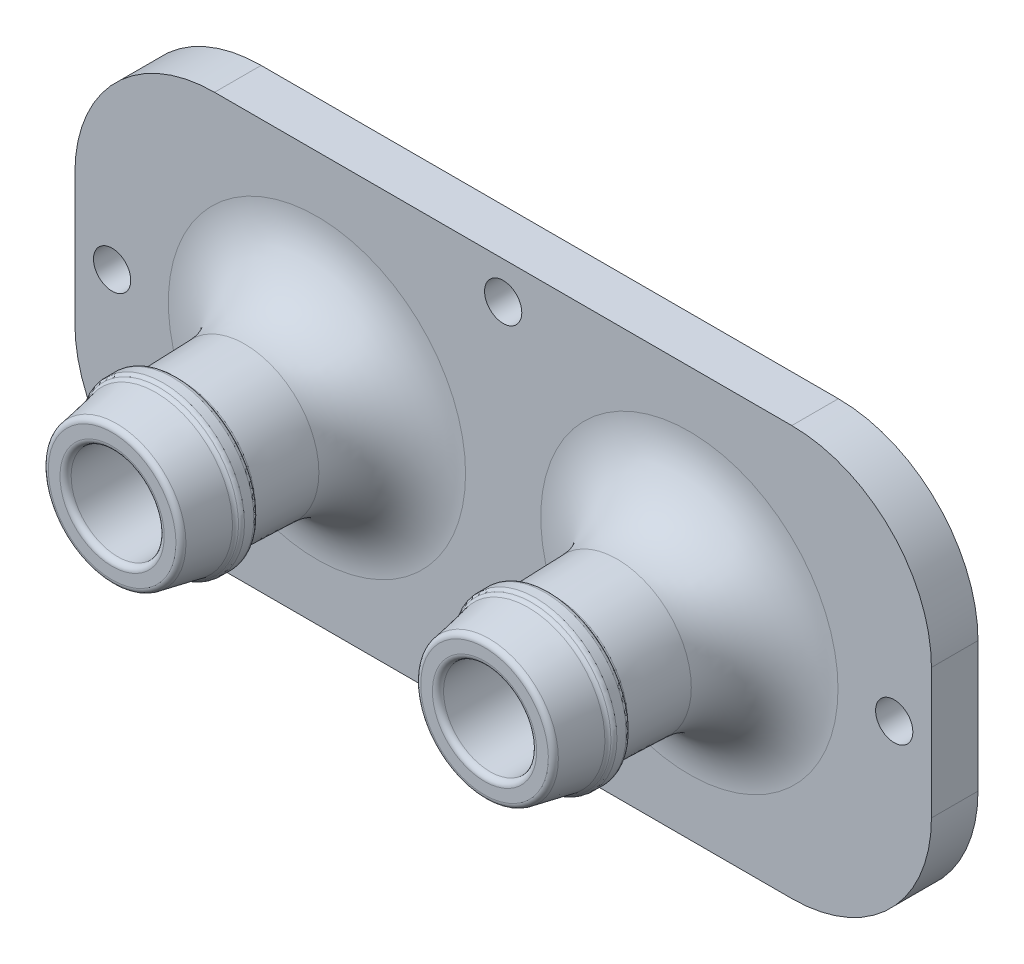
ISO-10303-21;
HEADER;
FILE_DESCRIPTION(('STEP AP214'),'2;1');
FILE_NAME('part.step','',(''),(''),'','','');
FILE_SCHEMA(('AUTOMOTIVE_DESIGN { 1 0 10303 214 1 1 1 1 }'));
ENDSEC;
DATA;
#1=APPLICATION_CONTEXT('core data for automotive mechanical design processes');
#2=APPLICATION_PROTOCOL_DEFINITION('international standard','automotive_design',2000,#1);
#3=PRODUCT_CONTEXT('',#1,'mechanical');
#4=PRODUCT('Part','Part','',(#3));
#5=PRODUCT_RELATED_PRODUCT_CATEGORY('part','',(#4));
#6=PRODUCT_DEFINITION_FORMATION('','',#4);
#7=PRODUCT_DEFINITION_CONTEXT('part definition',#1,'design');
#8=PRODUCT_DEFINITION('design','',#6,#7);
#9=PRODUCT_DEFINITION_SHAPE('','',#8);
#10=(LENGTH_UNIT() NAMED_UNIT(*) SI_UNIT(.MILLI.,.METRE.));
#11=(NAMED_UNIT(*) PLANE_ANGLE_UNIT() SI_UNIT($,.RADIAN.));
#12=(NAMED_UNIT(*) SI_UNIT($,.STERADIAN.) SOLID_ANGLE_UNIT());
#13=UNCERTAINTY_MEASURE_WITH_UNIT(LENGTH_MEASURE(1.E-05),#10,'distance_accuracy_value','');
#14=(GEOMETRIC_REPRESENTATION_CONTEXT(3) GLOBAL_UNCERTAINTY_ASSIGNED_CONTEXT((#13)) GLOBAL_UNIT_ASSIGNED_CONTEXT((#10,
#11,#12)) REPRESENTATION_CONTEXT('',''));
#15=CARTESIAN_POINT('',(0.,0.,0.));
#16=DIRECTION('',(0.,0.,1.));
#17=DIRECTION('',(1.,0.,0.));
#18=AXIS2_PLACEMENT_3D('',#15,#16,#17);
#19=CARTESIAN_POINT('',(0.,0.,0.));
#20=DIRECTION('',(0.,0.,1.));
#21=DIRECTION('',(1.,0.,0.));
#22=AXIS2_PLACEMENT_3D('',#19,#20,#21);
#23=PLANE('',#22);
#24=CARTESIAN_POINT('',(0.,18.,0.));
#25=DIRECTION('',(0.,0.,1.));
#26=DIRECTION('',(1.,0.,0.));
#27=AXIS2_PLACEMENT_3D('',#24,#25,#26);
#28=CIRCLE('',#27,2.);
#29=CARTESIAN_POINT('',(2.,18.,0.));
#30=VERTEX_POINT('',#29);
#31=EDGE_CURVE('E408',#30,#30,#28,.T.);
#32=ORIENTED_EDGE('',*,*,#31,.T.);
#33=EDGE_LOOP('',(#32));
#34=FACE_BOUND('',#33,.T.);
#35=CARTESIAN_POINT('',(0.,-18.,0.));
#36=DIRECTION('',(0.,0.,1.));
#37=DIRECTION('',(1.,0.,0.));
#38=AXIS2_PLACEMENT_3D('',#35,#36,#37);
#39=CIRCLE('',#38,2.);
#40=CARTESIAN_POINT('',(2.,-18.,0.));
#41=VERTEX_POINT('',#40);
#42=EDGE_CURVE('E412',#41,#41,#39,.T.);
#43=ORIENTED_EDGE('',*,*,#42,.T.);
#44=EDGE_LOOP('',(#43));
#45=FACE_BOUND('',#44,.T.);
#46=CARTESIAN_POINT('',(42.,0.,0.));
#47=DIRECTION('',(0.,0.,1.));
#48=DIRECTION('',(1.,0.,0.));
#49=AXIS2_PLACEMENT_3D('',#46,#47,#48);
#50=CIRCLE('',#49,2.00000000000001);
#51=CARTESIAN_POINT('',(44.,0.,0.));
#52=VERTEX_POINT('',#51);
#53=EDGE_CURVE('E422',#52,#52,#50,.T.);
#54=ORIENTED_EDGE('',*,*,#53,.T.);
#55=EDGE_LOOP('',(#54));
#56=FACE_BOUND('',#55,.T.);
#57=CARTESIAN_POINT('',(-42.,0.,0.));
#58=DIRECTION('',(0.,0.,1.));
#59=DIRECTION('',(1.,0.,0.));
#60=AXIS2_PLACEMENT_3D('',#57,#58,#59);
#61=CIRCLE('',#60,2.00000000000001);
#62=CARTESIAN_POINT('',(-40.,0.,0.));
#63=VERTEX_POINT('',#62);
#64=EDGE_CURVE('E428',#63,#63,#61,.T.);
#65=ORIENTED_EDGE('',*,*,#64,.T.);
#66=EDGE_LOOP('',(#65));
#67=FACE_BOUND('',#66,.T.);
#68=DIRECTION('',(-1.,0.,0.));
#69=VECTOR('',#68,1.);
#70=CARTESIAN_POINT('',(-46.,22.,0.));
#71=LINE('',#70,#69);
#72=CARTESIAN_POINT('',(31.,22.,0.));
#73=VERTEX_POINT('',#72);
#74=CARTESIAN_POINT('',(-31.,22.,0.));
#75=VERTEX_POINT('',#74);
#76=EDGE_CURVE('E171',#73,#75,#71,.T.);
#77=ORIENTED_EDGE('',*,*,#76,.F.);
#78=CARTESIAN_POINT('',(31.,7.,0.));
#79=DIRECTION('',(0.,0.,1.));
#80=DIRECTION('',(1.,0.,0.));
#81=AXIS2_PLACEMENT_3D('',#78,#79,#80);
#82=CIRCLE('',#81,15.);
#83=CARTESIAN_POINT('',(46.,7.,0.));
#84=VERTEX_POINT('',#83);
#85=EDGE_CURVE('E182',#73,#84,#82,.F.);
#86=ORIENTED_EDGE('',*,*,#85,.T.);
#87=DIRECTION('',(0.,1.,0.));
#88=VECTOR('',#87,1.);
#89=CARTESIAN_POINT('',(46.,22.,0.));
#90=LINE('',#89,#88);
#91=CARTESIAN_POINT('',(46.,-7.,0.));
#92=VERTEX_POINT('',#91);
#93=EDGE_CURVE('E168',#92,#84,#90,.T.);
#94=ORIENTED_EDGE('',*,*,#93,.F.);
#95=CARTESIAN_POINT('',(31.,-7.,0.));
#96=DIRECTION('',(0.,0.,1.));
#97=DIRECTION('',(1.,0.,0.));
#98=AXIS2_PLACEMENT_3D('',#95,#96,#97);
#99=CIRCLE('',#98,15.);
#100=CARTESIAN_POINT('',(31.,-22.,0.));
#101=VERTEX_POINT('',#100);
#102=EDGE_CURVE('E61',#92,#101,#99,.F.);
#103=ORIENTED_EDGE('',*,*,#102,.T.);
#104=DIRECTION('',(1.,0.,0.));
#105=VECTOR('',#104,1.);
#106=CARTESIAN_POINT('',(-46.,-22.,0.));
#107=LINE('',#106,#105);
#108=CARTESIAN_POINT('',(-31.,-22.,0.));
#109=VERTEX_POINT('',#108);
#110=EDGE_CURVE('E166',#109,#101,#107,.T.);
#111=ORIENTED_EDGE('',*,*,#110,.F.);
#112=CARTESIAN_POINT('',(-31.,-7.,0.));
#113=DIRECTION('',(0.,0.,1.));
#114=DIRECTION('',(1.,0.,0.));
#115=AXIS2_PLACEMENT_3D('',#112,#113,#114);
#116=CIRCLE('',#115,15.);
#117=CARTESIAN_POINT('',(-46.,-7.,0.));
#118=VERTEX_POINT('',#117);
#119=EDGE_CURVE('E69',#109,#118,#116,.F.);
#120=ORIENTED_EDGE('',*,*,#119,.T.);
#121=DIRECTION('',(0.,-1.,0.));
#122=VECTOR('',#121,1.);
#123=CARTESIAN_POINT('',(-46.,22.,0.));
#124=LINE('',#123,#122);
#125=CARTESIAN_POINT('',(-46.,7.,0.));
#126=VERTEX_POINT('',#125);
#127=EDGE_CURVE('E164',#126,#118,#124,.T.);
#128=ORIENTED_EDGE('',*,*,#127,.F.);
#129=CARTESIAN_POINT('',(-31.,7.,0.));
#130=DIRECTION('',(0.,0.,1.));
#131=DIRECTION('',(1.,0.,0.));
#132=AXIS2_PLACEMENT_3D('',#129,#130,#131);
#133=CIRCLE('',#132,15.);
#134=EDGE_CURVE('E118',#126,#75,#133,.F.);
#135=ORIENTED_EDGE('',*,*,#134,.T.);
#136=EDGE_LOOP('',(#77,#86,#94,#103,#111,#120,#128,#135));
#137=FACE_BOUND('',#136,.T.);
#138=CARTESIAN_POINT('',(20.,0.,0.));
#139=DIRECTION('',(0.,0.,1.));
#140=DIRECTION('',(1.,0.,0.));
#141=AXIS2_PLACEMENT_3D('',#138,#139,#140);
#142=CIRCLE('',#141,17.);
#143=CARTESIAN_POINT('',(37.,0.,0.));
#144=VERTEX_POINT('',#143);
#145=EDGE_CURVE('E161',#144,#144,#142,.T.);
#146=ORIENTED_EDGE('',*,*,#145,.T.);
#147=EDGE_LOOP('',(#146));
#148=FACE_BOUND('',#147,.T.);
#149=CARTESIAN_POINT('',(-20.,0.,0.));
#150=DIRECTION('',(0.,0.,1.));
#151=DIRECTION('',(1.,0.,0.));
#152=AXIS2_PLACEMENT_3D('',#149,#150,#151);
#153=CIRCLE('',#152,17.);
#154=CARTESIAN_POINT('',(-3.,0.,0.));
#155=VERTEX_POINT('',#154);
#156=EDGE_CURVE('E158',#155,#155,#153,.T.);
#157=ORIENTED_EDGE('',*,*,#156,.T.);
#158=EDGE_LOOP('',(#157));
#159=FACE_BOUND('',#158,.T.);
#160=ADVANCED_FACE('F46',(#34,#45,#56,#67,#137,#148,#159),#23,.F.);
#161=CARTESIAN_POINT('',(-46.,22.,3.));
#162=DIRECTION('',(1.,0.,0.));
#163=DIRECTION('',(0.,0.,-1.));
#164=AXIS2_PLACEMENT_3D('',#161,#162,#163);
#165=PLANE('',#164);
#166=DIRECTION('',(0.,0.,-1.));
#167=VECTOR('',#166,1.);
#168=CARTESIAN_POINT('',(-46.,-7.,3.));
#169=LINE('',#168,#167);
#170=CARTESIAN_POINT('',(-46.,-7.,5.));
#171=VERTEX_POINT('',#170);
#172=EDGE_CURVE('E123',#118,#171,#169,.F.);
#173=ORIENTED_EDGE('',*,*,#172,.T.);
#174=DIRECTION('',(0.,-1.,0.));
#175=VECTOR('',#174,1.);
#176=CARTESIAN_POINT('',(-46.,7.,5.));
#177=LINE('',#176,#175);
#178=CARTESIAN_POINT('',(-46.,7.,5.));
#179=VERTEX_POINT('',#178);
#180=EDGE_CURVE('E126',#179,#171,#177,.T.);
#181=ORIENTED_EDGE('',*,*,#180,.F.);
#182=DIRECTION('',(0.,0.,-1.));
#183=VECTOR('',#182,1.);
#184=CARTESIAN_POINT('',(-46.,7.,3.));
#185=LINE('',#184,#183);
#186=EDGE_CURVE('E112',#179,#126,#185,.T.);
#187=ORIENTED_EDGE('',*,*,#186,.T.);
#188=ORIENTED_EDGE('',*,*,#127,.T.);
#189=EDGE_LOOP('',(#173,#181,#187,#188));
#190=FACE_BOUND('',#189,.T.);
#191=ADVANCED_FACE('F127',(#190),#165,.F.);
#192=CARTESIAN_POINT('',(-46.,-22.,3.));
#193=DIRECTION('',(0.,1.,0.));
#194=DIRECTION('',(0.,0.,1.));
#195=AXIS2_PLACEMENT_3D('',#192,#193,#194);
#196=PLANE('',#195);
#197=ORIENTED_EDGE('',*,*,#110,.T.);
#198=DIRECTION('',(0.,0.,-1.));
#199=VECTOR('',#198,1.);
#200=CARTESIAN_POINT('',(31.,-22.,3.));
#201=LINE('',#200,#199);
#202=CARTESIAN_POINT('',(31.,-22.,5.));
#203=VERTEX_POINT('',#202);
#204=EDGE_CURVE('E191',#101,#203,#201,.F.);
#205=ORIENTED_EDGE('',*,*,#204,.T.);
#206=DIRECTION('',(1.,0.,0.));
#207=VECTOR('',#206,1.);
#208=CARTESIAN_POINT('',(-31.,-22.,5.));
#209=LINE('',#208,#207);
#210=CARTESIAN_POINT('',(-31.,-22.,5.));
#211=VERTEX_POINT('',#210);
#212=EDGE_CURVE('E146',#211,#203,#209,.T.);
#213=ORIENTED_EDGE('',*,*,#212,.F.);
#214=DIRECTION('',(0.,0.,-1.));
#215=VECTOR('',#214,1.);
#216=CARTESIAN_POINT('',(-31.,-22.,3.));
#217=LINE('',#216,#215);
#218=EDGE_CURVE('E189',#211,#109,#217,.T.);
#219=ORIENTED_EDGE('',*,*,#218,.T.);
#220=EDGE_LOOP('',(#197,#205,#213,#219));
#221=FACE_BOUND('',#220,.T.);
#222=ADVANCED_FACE('F241',(#221),#196,.F.);
#223=CARTESIAN_POINT('',(46.,22.,3.));
#224=DIRECTION('',(-1.,0.,0.));
#225=DIRECTION('',(0.,0.,1.));
#226=AXIS2_PLACEMENT_3D('',#223,#224,#225);
#227=PLANE('',#226);
#228=ORIENTED_EDGE('',*,*,#93,.T.);
#229=DIRECTION('',(0.,0.,-1.));
#230=VECTOR('',#229,1.);
#231=CARTESIAN_POINT('',(46.,7.,3.));
#232=LINE('',#231,#230);
#233=CARTESIAN_POINT('',(46.,7.,5.));
#234=VERTEX_POINT('',#233);
#235=EDGE_CURVE('E187',#84,#234,#232,.F.);
#236=ORIENTED_EDGE('',*,*,#235,.T.);
#237=DIRECTION('',(0.,1.,0.));
#238=VECTOR('',#237,1.);
#239=CARTESIAN_POINT('',(46.,-7.,5.));
#240=LINE('',#239,#238);
#241=CARTESIAN_POINT('',(46.,-7.,5.));
#242=VERTEX_POINT('',#241);
#243=EDGE_CURVE('E152',#242,#234,#240,.T.);
#244=ORIENTED_EDGE('',*,*,#243,.F.);
#245=DIRECTION('',(0.,0.,-1.));
#246=VECTOR('',#245,1.);
#247=CARTESIAN_POINT('',(46.,-7.,3.));
#248=LINE('',#247,#246);
#249=EDGE_CURVE('E184',#242,#92,#248,.T.);
#250=ORIENTED_EDGE('',*,*,#249,.T.);
#251=EDGE_LOOP('',(#228,#236,#244,#250));
#252=FACE_BOUND('',#251,.T.);
#253=ADVANCED_FACE('F251',(#252),#227,.F.);
#254=CARTESIAN_POINT('',(-46.,22.,3.));
#255=DIRECTION('',(0.,-1.,0.));
#256=DIRECTION('',(0.,0.,-1.));
#257=AXIS2_PLACEMENT_3D('',#254,#255,#256);
#258=PLANE('',#257);
#259=DIRECTION('',(0.,0.,-1.));
#260=VECTOR('',#259,1.);
#261=CARTESIAN_POINT('',(-31.,22.,3.));
#262=LINE('',#261,#260);
#263=CARTESIAN_POINT('',(-31.,22.,5.));
#264=VERTEX_POINT('',#263);
#265=EDGE_CURVE('E174',#75,#264,#262,.F.);
#266=ORIENTED_EDGE('',*,*,#265,.T.);
#267=DIRECTION('',(-1.,0.,0.));
#268=VECTOR('',#267,1.);
#269=CARTESIAN_POINT('',(31.,22.,5.));
#270=LINE('',#269,#268);
#271=CARTESIAN_POINT('',(31.,22.,5.));
#272=VERTEX_POINT('',#271);
#273=EDGE_CURVE('E137',#272,#264,#270,.T.);
#274=ORIENTED_EDGE('',*,*,#273,.F.);
#275=DIRECTION('',(0.,0.,-1.));
#276=VECTOR('',#275,1.);
#277=CARTESIAN_POINT('',(31.,22.,3.));
#278=LINE('',#277,#276);
#279=EDGE_CURVE('E176',#272,#73,#278,.T.);
#280=ORIENTED_EDGE('',*,*,#279,.T.);
#281=ORIENTED_EDGE('',*,*,#76,.T.);
#282=EDGE_LOOP('',(#266,#274,#280,#281));
#283=FACE_BOUND('',#282,.T.);
#284=ADVANCED_FACE('F248',(#283),#258,.F.);
#285=CARTESIAN_POINT('',(20.,0.,3.));
#286=DIRECTION('',(0.,0.,-1.));
#287=DIRECTION('',(-1.,0.,0.));
#288=AXIS2_PLACEMENT_3D('',#285,#286,#287);
#289=CYLINDRICAL_SURFACE('',#288,17.);
#290=CARTESIAN_POINT('',(20.,0.,1.));
#291=DIRECTION('',(0.,0.,1.));
#292=DIRECTION('',(1.,0.,0.));
#293=AXIS2_PLACEMENT_3D('',#290,#291,#292);
#294=CIRCLE('',#293,17.);
#295=CARTESIAN_POINT('',(37.,0.,1.));
#296=VERTEX_POINT('',#295);
#297=EDGE_CURVE('E54',#296,#296,#294,.T.);
#298=ORIENTED_EDGE('',*,*,#297,.T.);
#299=EDGE_LOOP('',(#298));
#300=FACE_BOUND('',#299,.T.);
#301=ORIENTED_EDGE('',*,*,#145,.F.);
#302=EDGE_LOOP('',(#301));
#303=FACE_BOUND('',#302,.T.);
#304=ADVANCED_FACE('F219',(#300,#303),#289,.F.);
#305=CARTESIAN_POINT('',(-20.,0.,3.));
#306=DIRECTION('',(0.,0.,-1.));
#307=DIRECTION('',(-1.,0.,0.));
#308=AXIS2_PLACEMENT_3D('',#305,#306,#307);
#309=CYLINDRICAL_SURFACE('',#308,17.);
#310=CARTESIAN_POINT('',(-20.,0.,1.));
#311=DIRECTION('',(0.,0.,1.));
#312=DIRECTION('',(1.,0.,0.));
#313=AXIS2_PLACEMENT_3D('',#310,#311,#312);
#314=CIRCLE('',#313,17.);
#315=CARTESIAN_POINT('',(-3.,0.,1.));
#316=VERTEX_POINT('',#315);
#317=EDGE_CURVE('E13',#316,#316,#314,.T.);
#318=ORIENTED_EDGE('',*,*,#317,.T.);
#319=EDGE_LOOP('',(#318));
#320=FACE_BOUND('',#319,.T.);
#321=ORIENTED_EDGE('',*,*,#156,.F.);
#322=EDGE_LOOP('',(#321));
#323=FACE_BOUND('',#322,.T.);
#324=ADVANCED_FACE('F263',(#320,#323),#309,.F.);
#325=CARTESIAN_POINT('',(31.,7.,3.));
#326=DIRECTION('',(0.,0.,-1.));
#327=DIRECTION('',(-1.,0.,0.));
#328=AXIS2_PLACEMENT_3D('',#325,#326,#327);
#329=CYLINDRICAL_SURFACE('',#328,15.);
#330=ORIENTED_EDGE('',*,*,#279,.F.);
#331=CARTESIAN_POINT('',(31.,7.,5.));
#332=DIRECTION('',(0.,0.,1.));
#333=DIRECTION('',(1.,0.,0.));
#334=AXIS2_PLACEMENT_3D('',#331,#332,#333);
#335=CIRCLE('',#334,15.);
#336=EDGE_CURVE('E155',#234,#272,#335,.T.);
#337=ORIENTED_EDGE('',*,*,#336,.F.);
#338=ORIENTED_EDGE('',*,*,#235,.F.);
#339=ORIENTED_EDGE('',*,*,#85,.F.);
#340=EDGE_LOOP('',(#330,#337,#338,#339));
#341=FACE_BOUND('',#340,.T.);
#342=ADVANCED_FACE('F259',(#341),#329,.T.);
#343=CARTESIAN_POINT('',(31.,-7.,3.));
#344=DIRECTION('',(0.,0.,-1.));
#345=DIRECTION('',(-1.,0.,0.));
#346=AXIS2_PLACEMENT_3D('',#343,#344,#345);
#347=CYLINDRICAL_SURFACE('',#346,15.);
#348=ORIENTED_EDGE('',*,*,#249,.F.);
#349=CARTESIAN_POINT('',(31.,-7.,5.));
#350=DIRECTION('',(0.,0.,1.));
#351=DIRECTION('',(1.,0.,0.));
#352=AXIS2_PLACEMENT_3D('',#349,#350,#351);
#353=CIRCLE('',#352,15.);
#354=EDGE_CURVE('E149',#203,#242,#353,.T.);
#355=ORIENTED_EDGE('',*,*,#354,.F.);
#356=ORIENTED_EDGE('',*,*,#204,.F.);
#357=ORIENTED_EDGE('',*,*,#102,.F.);
#358=EDGE_LOOP('',(#348,#355,#356,#357));
#359=FACE_BOUND('',#358,.T.);
#360=ADVANCED_FACE('F262',(#359),#347,.T.);
#361=CARTESIAN_POINT('',(-31.,7.,3.));
#362=DIRECTION('',(0.,0.,-1.));
#363=DIRECTION('',(-1.,0.,0.));
#364=AXIS2_PLACEMENT_3D('',#361,#362,#363);
#365=CYLINDRICAL_SURFACE('',#364,15.);
#366=ORIENTED_EDGE('',*,*,#186,.F.);
#367=CARTESIAN_POINT('',(-31.,7.,5.));
#368=DIRECTION('',(0.,0.,1.));
#369=DIRECTION('',(1.,0.,0.));
#370=AXIS2_PLACEMENT_3D('',#367,#368,#369);
#371=CIRCLE('',#370,15.);
#372=EDGE_CURVE('E117',#264,#179,#371,.T.);
#373=ORIENTED_EDGE('',*,*,#372,.F.);
#374=ORIENTED_EDGE('',*,*,#265,.F.);
#375=ORIENTED_EDGE('',*,*,#134,.F.);
#376=EDGE_LOOP('',(#366,#373,#374,#375));
#377=FACE_BOUND('',#376,.T.);
#378=ADVANCED_FACE('F114',(#377),#365,.T.);
#379=CARTESIAN_POINT('',(-31.,-7.,3.));
#380=DIRECTION('',(0.,0.,-1.));
#381=DIRECTION('',(-1.,0.,0.));
#382=AXIS2_PLACEMENT_3D('',#379,#380,#381);
#383=CYLINDRICAL_SURFACE('',#382,15.);
#384=ORIENTED_EDGE('',*,*,#218,.F.);
#385=CARTESIAN_POINT('',(-31.,-7.,5.));
#386=DIRECTION('',(0.,0.,1.));
#387=DIRECTION('',(1.,0.,0.));
#388=AXIS2_PLACEMENT_3D('',#385,#386,#387);
#389=CIRCLE('',#388,15.);
#390=EDGE_CURVE('E131',#171,#211,#389,.T.);
#391=ORIENTED_EDGE('',*,*,#390,.F.);
#392=ORIENTED_EDGE('',*,*,#172,.F.);
#393=ORIENTED_EDGE('',*,*,#119,.F.);
#394=EDGE_LOOP('',(#384,#391,#392,#393));
#395=FACE_BOUND('',#394,.T.);
#396=ADVANCED_FACE('F270',(#395),#383,.T.);
#397=CARTESIAN_POINT('',(-31.,7.,5.));
#398=DIRECTION('',(0.,0.,1.));
#399=DIRECTION('',(1.,0.,0.));
#400=AXIS2_PLACEMENT_3D('',#397,#398,#399);
#401=PLANE('',#400);
#402=CARTESIAN_POINT('',(0.,18.,5.));
#403=DIRECTION('',(0.,0.,1.));
#404=DIRECTION('',(1.,0.,0.));
#405=AXIS2_PLACEMENT_3D('',#402,#403,#404);
#406=CIRCLE('',#405,2.);
#407=CARTESIAN_POINT('',(2.,18.,5.));
#408=VERTEX_POINT('',#407);
#409=EDGE_CURVE('E411',#408,#408,#406,.T.);
#410=ORIENTED_EDGE('',*,*,#409,.F.);
#411=EDGE_LOOP('',(#410));
#412=FACE_BOUND('',#411,.T.);
#413=CARTESIAN_POINT('',(0.,-18.,5.));
#414=DIRECTION('',(0.,0.,1.));
#415=DIRECTION('',(1.,0.,0.));
#416=AXIS2_PLACEMENT_3D('',#413,#414,#415);
#417=CIRCLE('',#416,2.);
#418=CARTESIAN_POINT('',(2.,-18.,5.));
#419=VERTEX_POINT('',#418);
#420=EDGE_CURVE('E417',#419,#419,#417,.T.);
#421=ORIENTED_EDGE('',*,*,#420,.F.);
#422=EDGE_LOOP('',(#421));
#423=FACE_BOUND('',#422,.T.);
#424=CARTESIAN_POINT('',(42.,0.,5.));
#425=DIRECTION('',(0.,0.,1.));
#426=DIRECTION('',(1.,0.,0.));
#427=AXIS2_PLACEMENT_3D('',#424,#425,#426);
#428=CIRCLE('',#427,2.00000000000001);
#429=CARTESIAN_POINT('',(44.,0.,5.));
#430=VERTEX_POINT('',#429);
#431=EDGE_CURVE('E425',#430,#430,#428,.T.);
#432=ORIENTED_EDGE('',*,*,#431,.F.);
#433=EDGE_LOOP('',(#432));
#434=FACE_BOUND('',#433,.T.);
#435=CARTESIAN_POINT('',(-42.,0.,5.));
#436=DIRECTION('',(0.,0.,1.));
#437=DIRECTION('',(1.,0.,0.));
#438=AXIS2_PLACEMENT_3D('',#435,#436,#437);
#439=CIRCLE('',#438,2.00000000000001);
#440=CARTESIAN_POINT('',(-40.,0.,5.));
#441=VERTEX_POINT('',#440);
#442=EDGE_CURVE('E431',#441,#441,#439,.T.);
#443=ORIENTED_EDGE('',*,*,#442,.F.);
#444=EDGE_LOOP('',(#443));
#445=FACE_BOUND('',#444,.T.);
#446=CARTESIAN_POINT('',(20.,0.,5.));
#447=DIRECTION('',(0.,0.,1.));
#448=DIRECTION('',(1.,0.,0.));
#449=AXIS2_PLACEMENT_3D('',#446,#447,#448);
#450=CIRCLE('',#449,15.9635991903643);
#451=CARTESIAN_POINT('',(35.9635991903643,0.,5.));
#452=VERTEX_POINT('',#451);
#453=EDGE_CURVE('E196',#452,#452,#450,.F.);
#454=ORIENTED_EDGE('',*,*,#453,.T.);
#455=EDGE_LOOP('',(#454));
#456=FACE_BOUND('',#455,.T.);
#457=CARTESIAN_POINT('',(-20.,0.,5.));
#458=DIRECTION('',(0.,0.,1.));
#459=DIRECTION('',(1.,0.,0.));
#460=AXIS2_PLACEMENT_3D('',#457,#458,#459);
#461=CIRCLE('',#460,15.9635991903643);
#462=CARTESIAN_POINT('',(-4.0364008096357,0.,5.));
#463=VERTEX_POINT('',#462);
#464=EDGE_CURVE('E122',#463,#463,#461,.F.);
#465=ORIENTED_EDGE('',*,*,#464,.T.);
#466=EDGE_LOOP('',(#465));
#467=FACE_BOUND('',#466,.T.);
#468=ORIENTED_EDGE('',*,*,#372,.T.);
#469=ORIENTED_EDGE('',*,*,#180,.T.);
#470=ORIENTED_EDGE('',*,*,#390,.T.);
#471=ORIENTED_EDGE('',*,*,#212,.T.);
#472=ORIENTED_EDGE('',*,*,#354,.T.);
#473=ORIENTED_EDGE('',*,*,#243,.T.);
#474=ORIENTED_EDGE('',*,*,#336,.T.);
#475=ORIENTED_EDGE('',*,*,#273,.T.);
#476=EDGE_LOOP('',(#468,#469,#470,#471,#472,#473,#474,#475));
#477=FACE_BOUND('',#476,.T.);
#478=ADVANCED_FACE('F134',(#412,#423,#434,#445,#456,#467,#477),#401,.T.);
#479=CARTESIAN_POINT('',(-20.,0.,5.));
#480=DIRECTION('',(0.,0.,-1.));
#481=DIRECTION('',(-1.,0.,0.));
#482=AXIS2_PLACEMENT_3D('',#479,#480,#481);
#483=CYLINDRICAL_SURFACE('',#482,5.);
#484=CARTESIAN_POINT('',(-20.,0.,13.));
#485=DIRECTION('',(0.,0.,1.));
#486=DIRECTION('',(1.,0.,0.));
#487=AXIS2_PLACEMENT_3D('',#484,#485,#486);
#488=CIRCLE('',#487,5.);
#489=CARTESIAN_POINT('',(-15.,0.,13.));
#490=VERTEX_POINT('',#489);
#491=EDGE_CURVE('E208',#490,#490,#488,.F.);
#492=ORIENTED_EDGE('',*,*,#491,.T.);
#493=EDGE_LOOP('',(#492));
#494=FACE_BOUND('',#493,.T.);
#495=CARTESIAN_POINT('',(-20.,0.,26.4));
#496=DIRECTION('',(0.,0.,1.));
#497=DIRECTION('',(0.,-1.,0.));
#498=AXIS2_PLACEMENT_3D('',#495,#496,#497);
#499=CIRCLE('',#498,5.);
#500=CARTESIAN_POINT('',(-20.,-5.,26.4));
#501=VERTEX_POINT('',#500);
#502=EDGE_CURVE('E445',#501,#501,#499,.T.);
#503=ORIENTED_EDGE('',*,*,#502,.T.);
#504=EDGE_LOOP('',(#503));
#505=FACE_BOUND('',#504,.T.);
#506=ADVANCED_FACE('F302',(#494,#505),#483,.F.);
#507=CARTESIAN_POINT('',(20.,0.,5.));
#508=DIRECTION('',(0.,0.,-1.));
#509=DIRECTION('',(-1.,0.,0.));
#510=AXIS2_PLACEMENT_3D('',#507,#508,#509);
#511=CYLINDRICAL_SURFACE('',#510,5.);
#512=CARTESIAN_POINT('',(20.,0.,13.));
#513=DIRECTION('',(0.,0.,1.));
#514=DIRECTION('',(1.,0.,0.));
#515=AXIS2_PLACEMENT_3D('',#512,#513,#514);
#516=CIRCLE('',#515,5.);
#517=CARTESIAN_POINT('',(25.,0.,13.));
#518=VERTEX_POINT('',#517);
#519=EDGE_CURVE('E214',#518,#518,#516,.F.);
#520=ORIENTED_EDGE('',*,*,#519,.T.);
#521=EDGE_LOOP('',(#520));
#522=FACE_BOUND('',#521,.T.);
#523=CARTESIAN_POINT('',(20.,0.,26.4));
#524=DIRECTION('',(0.,0.,1.));
#525=DIRECTION('',(0.,-1.,0.));
#526=AXIS2_PLACEMENT_3D('',#523,#524,#525);
#527=CIRCLE('',#526,5.);
#528=CARTESIAN_POINT('',(20.,-5.,26.4));
#529=VERTEX_POINT('',#528);
#530=EDGE_CURVE('E475',#529,#529,#527,.T.);
#531=ORIENTED_EDGE('',*,*,#530,.T.);
#532=EDGE_LOOP('',(#531));
#533=FACE_BOUND('',#532,.T.);
#534=ADVANCED_FACE('F306',(#522,#533),#511,.F.);
#535=CARTESIAN_POINT('',(27.35,0.,27.));
#536=DIRECTION('',(0.,0.,1.));
#537=DIRECTION('',(0.,-1.,0.));
#538=AXIS2_PLACEMENT_3D('',#535,#536,#537);
#539=PLANE('',#538);
#540=CARTESIAN_POINT('',(20.,0.,27.));
#541=DIRECTION('',(0.,0.,1.));
#542=DIRECTION('',(0.,-1.,0.));
#543=AXIS2_PLACEMENT_3D('',#540,#541,#542);
#544=CIRCLE('',#543,5.6);
#545=CARTESIAN_POINT('',(20.,-5.6,27.));
#546=VERTEX_POINT('',#545);
#547=EDGE_CURVE('E472',#546,#546,#544,.F.);
#548=ORIENTED_EDGE('',*,*,#547,.T.);
#549=EDGE_LOOP('',(#548));
#550=FACE_BOUND('',#549,.T.);
#551=CARTESIAN_POINT('',(20.,0.,27.));
#552=DIRECTION('',(0.,0.,1.));
#553=DIRECTION('',(0.,-1.,0.));
#554=AXIS2_PLACEMENT_3D('',#551,#552,#553);
#555=CIRCLE('',#554,6.85326601535529);
#556=CARTESIAN_POINT('',(20.,-6.85326601535529,27.));
#557=VERTEX_POINT('',#556);
#558=EDGE_CURVE('E469',#557,#557,#555,.T.);
#559=ORIENTED_EDGE('',*,*,#558,.T.);
#560=EDGE_LOOP('',(#559));
#561=FACE_BOUND('',#560,.T.);
#562=ADVANCED_FACE('F310',(#550,#561),#539,.T.);
#563=CARTESIAN_POINT('',(20.,0.,5.));
#564=DIRECTION('',(0.,0.,-1.));
#565=DIRECTION('',(0.,1.,0.));
#566=AXIS2_PLACEMENT_3D('',#563,#564,#565);
#567=CONICAL_SURFACE('',#566,8.2,0.0299910048568778);
#568=CARTESIAN_POINT('',(20.,0.,12.7601079271546));
#569=DIRECTION('',(0.,0.,-1.));
#570=DIRECTION('',(-1.,0.,0.));
#571=AXIS2_PLACEMENT_3D('',#568,#569,#570);
#572=CIRCLE('',#571,7.96719676218536);
#573=CARTESIAN_POINT('',(12.0328032378146,0.,12.7601079271546));
#574=VERTEX_POINT('',#573);
#575=EDGE_CURVE('E199',#574,#574,#572,.F.);
#576=ORIENTED_EDGE('',*,*,#575,.T.);
#577=EDGE_LOOP('',(#576));
#578=FACE_BOUND('',#577,.T.);
#579=CARTESIAN_POINT('',(20.,0.,19.39134138244));
#580=DIRECTION('',(0.,0.,-1.));
#581=DIRECTION('',(0.,1.,0.));
#582=AXIS2_PLACEMENT_3D('',#579,#580,#581);
#583=CIRCLE('',#582,7.7682597585268);
#584=CARTESIAN_POINT('',(20.,7.76825975852681,19.39134138244));
#585=VERTEX_POINT('',#584);
#586=EDGE_CURVE('E484',#585,#585,#583,.T.);
#587=ORIENTED_EDGE('',*,*,#586,.T.);
#588=EDGE_LOOP('',(#587));
#589=FACE_BOUND('',#588,.T.);
#590=ADVANCED_FACE('F340',(#578,#589),#567,.T.);
#591=CARTESIAN_POINT('',(20.,0.,5.));
#592=DIRECTION('',(0.,0.,-1.));
#593=DIRECTION('',(0.,1.,0.));
#594=AXIS2_PLACEMENT_3D('',#591,#592,#593);
#595=CYLINDRICAL_SURFACE('',#594,8.725);
#596=CARTESIAN_POINT('',(20.,0.,20.5));
#597=DIRECTION('',(0.,0.,-1.));
#598=DIRECTION('',(0.,1.,0.));
#599=AXIS2_PLACEMENT_3D('',#596,#597,#598);
#600=CIRCLE('',#599,8.725);
#601=CARTESIAN_POINT('',(20.,8.725,20.5));
#602=VERTEX_POINT('',#601);
#603=EDGE_CURVE('E466',#602,#602,#600,.F.);
#604=ORIENTED_EDGE('',*,*,#603,.T.);
#605=EDGE_LOOP('',(#604));
#606=FACE_BOUND('',#605,.T.);
#607=CARTESIAN_POINT('',(20.,0.,21.5056570016679));
#608=DIRECTION('',(0.,0.,1.));
#609=DIRECTION('',(0.,-1.,0.));
#610=AXIS2_PLACEMENT_3D('',#607,#608,#609);
#611=CIRCLE('',#610,8.725);
#612=CARTESIAN_POINT('',(20.,-8.725,21.5056570016679));
#613=VERTEX_POINT('',#612);
#614=EDGE_CURVE('E463',#613,#613,#611,.F.);
#615=ORIENTED_EDGE('',*,*,#614,.T.);
#616=EDGE_LOOP('',(#615));
#617=FACE_BOUND('',#616,.T.);
#618=ADVANCED_FACE('F344',(#606,#617),#595,.T.);
#619=CARTESIAN_POINT('',(20.,0.,22.));
#620=DIRECTION('',(0.,0.,-1.));
#621=DIRECTION('',(0.,1.,0.));
#622=AXIS2_PLACEMENT_3D('',#619,#620,#621);
#623=CONICAL_SURFACE('',#622,8.3,0.187761946513593);
#624=CARTESIAN_POINT('',(20.,0.,26.511996387494));
#625=DIRECTION('',(0.,0.,1.));
#626=DIRECTION('',(0.,-1.,0.));
#627=AXIS2_PLACEMENT_3D('',#624,#625,#626);
#628=CIRCLE('',#627,7.44272068637615);
#629=CARTESIAN_POINT('',(20.,-7.44272068637614,26.511996387494));
#630=VERTEX_POINT('',#629);
#631=EDGE_CURVE('E481',#630,#630,#628,.F.);
#632=ORIENTED_EDGE('',*,*,#631,.T.);
#633=EDGE_LOOP('',(#632));
#634=FACE_BOUND('',#633,.T.);
#635=CARTESIAN_POINT('',(20.,0.,22.3122591132258));
#636=DIRECTION('',(0.,0.,-1.));
#637=DIRECTION('',(0.,1.,0.));
#638=AXIS2_PLACEMENT_3D('',#635,#636,#637);
#639=CIRCLE('',#638,8.24067076848711);
#640=CARTESIAN_POINT('',(20.,8.24067076848711,22.3122591132258));
#641=VERTEX_POINT('',#640);
#642=EDGE_CURVE('E478',#641,#641,#639,.F.);
#643=ORIENTED_EDGE('',*,*,#642,.T.);
#644=EDGE_LOOP('',(#643));
#645=FACE_BOUND('',#644,.T.);
#646=ADVANCED_FACE('F336',(#634,#645),#623,.T.);
#647=CARTESIAN_POINT('',(20.,0.,20.5));
#648=DIRECTION('',(0.,0.,-1.));
#649=DIRECTION('',(0.,1.,0.));
#650=AXIS2_PLACEMENT_3D('',#647,#648,#649);
#651=TOROIDAL_SURFACE('',#650,8.225,0.5);
#652=CARTESIAN_POINT('',(20.,0.,20.0042424035935));
#653=DIRECTION('',(0.,0.,1.));
#654=DIRECTION('',(0.,-1.,0.));
#655=AXIS2_PLACEMENT_3D('',#652,#653,#654);
#656=CIRCLE('',#655,8.28999542756359);
#657=CARTESIAN_POINT('',(20.,-8.28999542756359,20.0042424035935));
#658=VERTEX_POINT('',#657);
#659=EDGE_CURVE('E141',#658,#658,#656,.T.);
#660=ORIENTED_EDGE('',*,*,#659,.T.);
#661=EDGE_LOOP('',(#660));
#662=FACE_BOUND('',#661,.T.);
#663=ORIENTED_EDGE('',*,*,#603,.F.);
#664=EDGE_LOOP('',(#663));
#665=FACE_BOUND('',#664,.T.);
#666=ADVANCED_FACE('F332',(#662,#665),#651,.T.);
#667=CARTESIAN_POINT('',(20.,0.,21.5056570016679));
#668=DIRECTION('',(0.,0.,1.));
#669=DIRECTION('',(0.,-1.,0.));
#670=AXIS2_PLACEMENT_3D('',#667,#668,#669);
#671=TOROIDAL_SURFACE('',#670,8.225,0.5);
#672=CARTESIAN_POINT('',(20.,0.,21.9232017739642));
#673=DIRECTION('',(0.,0.,-1.));
#674=DIRECTION('',(0.,1.,0.));
#675=AXIS2_PLACEMENT_3D('',#672,#673,#674);
#676=CIRCLE('',#675,8.50005701795821);
#677=CARTESIAN_POINT('',(20.,8.50005701795821,21.9232017739642));
#678=VERTEX_POINT('',#677);
#679=EDGE_CURVE('E138',#678,#678,#676,.T.);
#680=ORIENTED_EDGE('',*,*,#679,.T.);
#681=EDGE_LOOP('',(#680));
#682=FACE_BOUND('',#681,.T.);
#683=ORIENTED_EDGE('',*,*,#614,.F.);
#684=EDGE_LOOP('',(#683));
#685=FACE_BOUND('',#684,.T.);
#686=ADVANCED_FACE('F328',(#682,#685),#671,.T.);
#687=CARTESIAN_POINT('',(20.,0.,26.4));
#688=DIRECTION('',(0.,0.,1.));
#689=DIRECTION('',(0.,-1.,0.));
#690=AXIS2_PLACEMENT_3D('',#687,#688,#689);
#691=TOROIDAL_SURFACE('',#690,5.6,0.6);
#692=ORIENTED_EDGE('',*,*,#530,.F.);
#693=EDGE_LOOP('',(#692));
#694=FACE_BOUND('',#693,.T.);
#695=ORIENTED_EDGE('',*,*,#547,.F.);
#696=EDGE_LOOP('',(#695));
#697=FACE_BOUND('',#696,.T.);
#698=ADVANCED_FACE('F324',(#694,#697),#691,.T.);
#699=CARTESIAN_POINT('',(20.,0.,26.4));
#700=DIRECTION('',(0.,0.,1.));
#701=DIRECTION('',(0.,-1.,0.));
#702=AXIS2_PLACEMENT_3D('',#699,#700,#701);
#703=TOROIDAL_SURFACE('',#702,6.85326601535529,0.6);
#704=ORIENTED_EDGE('',*,*,#558,.F.);
#705=EDGE_LOOP('',(#704));
#706=FACE_BOUND('',#705,.T.);
#707=ORIENTED_EDGE('',*,*,#631,.F.);
#708=EDGE_LOOP('',(#707));
#709=FACE_BOUND('',#708,.T.);
#710=ADVANCED_FACE('F320',(#706,#709),#703,.T.);
#711=CARTESIAN_POINT('',(20.,0.,19.4093332879034));
#712=DIRECTION('',(0.,0.,-1.));
#713=DIRECTION('',(0.,1.,0.));
#714=AXIS2_PLACEMENT_3D('',#711,#712,#713);
#715=TOROIDAL_SURFACE('',#714,8.36798994064022,0.6);
#716=ORIENTED_EDGE('',*,*,#659,.F.);
#717=EDGE_LOOP('',(#716));
#718=FACE_BOUND('',#717,.T.);
#719=ORIENTED_EDGE('',*,*,#586,.F.);
#720=EDGE_LOOP('',(#719));
#721=FACE_BOUND('',#720,.T.);
#722=ADVANCED_FACE('F316',(#718,#721),#715,.F.);
#723=CARTESIAN_POINT('',(20.,0.,22.4242555007197));
#724=DIRECTION('',(0.,0.,-1.));
#725=DIRECTION('',(0.,1.,0.));
#726=AXIS2_PLACEMENT_3D('',#723,#724,#725);
#727=TOROIDAL_SURFACE('',#726,8.83012543950796,0.6);
#728=ORIENTED_EDGE('',*,*,#642,.F.);
#729=EDGE_LOOP('',(#728));
#730=FACE_BOUND('',#729,.T.);
#731=ORIENTED_EDGE('',*,*,#679,.F.);
#732=EDGE_LOOP('',(#731));
#733=FACE_BOUND('',#732,.T.);
#734=ADVANCED_FACE('F312',(#730,#733),#727,.F.);
#735=CARTESIAN_POINT('',(-12.65,0.,27.));
#736=DIRECTION('',(0.,0.,1.));
#737=DIRECTION('',(0.,-1.,0.));
#738=AXIS2_PLACEMENT_3D('',#735,#736,#737);
#739=PLANE('',#738);
#740=CARTESIAN_POINT('',(-20.,0.,27.));
#741=DIRECTION('',(0.,0.,1.));
#742=DIRECTION('',(0.,-1.,0.));
#743=AXIS2_PLACEMENT_3D('',#740,#741,#742);
#744=CIRCLE('',#743,5.6);
#745=CARTESIAN_POINT('',(-20.,-5.6,27.));
#746=VERTEX_POINT('',#745);
#747=EDGE_CURVE('E442',#746,#746,#744,.F.);
#748=ORIENTED_EDGE('',*,*,#747,.T.);
#749=EDGE_LOOP('',(#748));
#750=FACE_BOUND('',#749,.T.);
#751=CARTESIAN_POINT('',(-20.,0.,27.));
#752=DIRECTION('',(0.,0.,1.));
#753=DIRECTION('',(0.,-1.,0.));
#754=AXIS2_PLACEMENT_3D('',#751,#752,#753);
#755=CIRCLE('',#754,6.85326601535529);
#756=CARTESIAN_POINT('',(-20.,-6.85326601535529,27.));
#757=VERTEX_POINT('',#756);
#758=EDGE_CURVE('E439',#757,#757,#755,.T.);
#759=ORIENTED_EDGE('',*,*,#758,.T.);
#760=EDGE_LOOP('',(#759));
#761=FACE_BOUND('',#760,.T.);
#762=ADVANCED_FACE('F315',(#750,#761),#739,.T.);
#763=CARTESIAN_POINT('',(-20.,0.,5.));
#764=DIRECTION('',(0.,0.,-1.));
#765=DIRECTION('',(0.,1.,0.));
#766=AXIS2_PLACEMENT_3D('',#763,#764,#765);
#767=CONICAL_SURFACE('',#766,8.2,0.0299910048568778);
#768=CARTESIAN_POINT('',(-20.,0.,12.7601079271546));
#769=DIRECTION('',(0.,0.,-1.));
#770=DIRECTION('',(-1.,0.,0.));
#771=AXIS2_PLACEMENT_3D('',#768,#769,#770);
#772=CIRCLE('',#771,7.96719676218536);
#773=CARTESIAN_POINT('',(-27.9671967621854,0.,12.7601079271546));
#774=VERTEX_POINT('',#773);
#775=EDGE_CURVE('E202',#774,#774,#772,.F.);
#776=ORIENTED_EDGE('',*,*,#775,.T.);
#777=EDGE_LOOP('',(#776));
#778=FACE_BOUND('',#777,.T.);
#779=CARTESIAN_POINT('',(-20.,0.,19.39134138244));
#780=DIRECTION('',(0.,0.,-1.));
#781=DIRECTION('',(0.,1.,0.));
#782=AXIS2_PLACEMENT_3D('',#779,#780,#781);
#783=CIRCLE('',#782,7.7682597585268);
#784=CARTESIAN_POINT('',(-20.,7.7682597585268,19.39134138244));
#785=VERTEX_POINT('',#784);
#786=EDGE_CURVE('E454',#785,#785,#783,.T.);
#787=ORIENTED_EDGE('',*,*,#786,.T.);
#788=EDGE_LOOP('',(#787));
#789=FACE_BOUND('',#788,.T.);
#790=ADVANCED_FACE('F378',(#778,#789),#767,.T.);
#791=CARTESIAN_POINT('',(-20.,0.,5.));
#792=DIRECTION('',(0.,0.,-1.));
#793=DIRECTION('',(0.,1.,0.));
#794=AXIS2_PLACEMENT_3D('',#791,#792,#793);
#795=CYLINDRICAL_SURFACE('',#794,8.725);
#796=CARTESIAN_POINT('',(-20.,0.,20.5));
#797=DIRECTION('',(0.,0.,-1.));
#798=DIRECTION('',(0.,1.,0.));
#799=AXIS2_PLACEMENT_3D('',#796,#797,#798);
#800=CIRCLE('',#799,8.725);
#801=CARTESIAN_POINT('',(-20.,8.725,20.5));
#802=VERTEX_POINT('',#801);
#803=EDGE_CURVE('E436',#802,#802,#800,.F.);
#804=ORIENTED_EDGE('',*,*,#803,.T.);
#805=EDGE_LOOP('',(#804));
#806=FACE_BOUND('',#805,.T.);
#807=CARTESIAN_POINT('',(-20.,0.,21.5056570016679));
#808=DIRECTION('',(0.,0.,1.));
#809=DIRECTION('',(0.,-1.,0.));
#810=AXIS2_PLACEMENT_3D('',#807,#808,#809);
#811=CIRCLE('',#810,8.725);
#812=CARTESIAN_POINT('',(-20.,-8.725,21.5056570016679));
#813=VERTEX_POINT('',#812);
#814=EDGE_CURVE('E414',#813,#813,#811,.F.);
#815=ORIENTED_EDGE('',*,*,#814,.T.);
#816=EDGE_LOOP('',(#815));
#817=FACE_BOUND('',#816,.T.);
#818=ADVANCED_FACE('F382',(#806,#817),#795,.T.);
#819=CARTESIAN_POINT('',(-20.,0.,22.));
#820=DIRECTION('',(0.,0.,-1.));
#821=DIRECTION('',(0.,1.,0.));
#822=AXIS2_PLACEMENT_3D('',#819,#820,#821);
#823=CONICAL_SURFACE('',#822,8.3,0.187761946513593);
#824=CARTESIAN_POINT('',(-20.,0.,26.511996387494));
#825=DIRECTION('',(0.,0.,1.));
#826=DIRECTION('',(0.,-1.,0.));
#827=AXIS2_PLACEMENT_3D('',#824,#825,#826);
#828=CIRCLE('',#827,7.44272068637615);
#829=CARTESIAN_POINT('',(-20.,-7.44272068637615,26.511996387494));
#830=VERTEX_POINT('',#829);
#831=EDGE_CURVE('E451',#830,#830,#828,.F.);
#832=ORIENTED_EDGE('',*,*,#831,.T.);
#833=EDGE_LOOP('',(#832));
#834=FACE_BOUND('',#833,.T.);
#835=CARTESIAN_POINT('',(-20.,0.,22.3122591132257));
#836=DIRECTION('',(0.,0.,-1.));
#837=DIRECTION('',(0.,1.,0.));
#838=AXIS2_PLACEMENT_3D('',#835,#836,#837);
#839=CIRCLE('',#838,8.24067076848711);
#840=CARTESIAN_POINT('',(-20.,8.24067076848711,22.3122591132257));
#841=VERTEX_POINT('',#840);
#842=EDGE_CURVE('E448',#841,#841,#839,.F.);
#843=ORIENTED_EDGE('',*,*,#842,.T.);
#844=EDGE_LOOP('',(#843));
#845=FACE_BOUND('',#844,.T.);
#846=ADVANCED_FACE('F374',(#834,#845),#823,.T.);
#847=CARTESIAN_POINT('',(-20.,0.,20.5));
#848=DIRECTION('',(0.,0.,-1.));
#849=DIRECTION('',(0.,1.,0.));
#850=AXIS2_PLACEMENT_3D('',#847,#848,#849);
#851=TOROIDAL_SURFACE('',#850,8.225,0.5);
#852=CARTESIAN_POINT('',(-20.,0.,20.0042424035935));
#853=DIRECTION('',(0.,0.,1.));
#854=DIRECTION('',(0.,-1.,0.));
#855=AXIS2_PLACEMENT_3D('',#852,#853,#854);
#856=CIRCLE('',#855,8.28999542756359);
#857=CARTESIAN_POINT('',(-20.,-8.28999542756359,20.0042424035935));
#858=VERTEX_POINT('',#857);
#859=EDGE_CURVE('E457',#858,#858,#856,.T.);
#860=ORIENTED_EDGE('',*,*,#859,.T.);
#861=EDGE_LOOP('',(#860));
#862=FACE_BOUND('',#861,.T.);
#863=ORIENTED_EDGE('',*,*,#803,.F.);
#864=EDGE_LOOP('',(#863));
#865=FACE_BOUND('',#864,.T.);
#866=ADVANCED_FACE('F370',(#862,#865),#851,.T.);
#867=CARTESIAN_POINT('',(-20.,0.,21.5056570016679));
#868=DIRECTION('',(0.,0.,1.));
#869=DIRECTION('',(0.,-1.,0.));
#870=AXIS2_PLACEMENT_3D('',#867,#868,#869);
#871=TOROIDAL_SURFACE('',#870,8.225,0.5);
#872=CARTESIAN_POINT('',(-20.,0.,21.9232017739642));
#873=DIRECTION('',(0.,0.,-1.));
#874=DIRECTION('',(0.,1.,0.));
#875=AXIS2_PLACEMENT_3D('',#872,#873,#874);
#876=CIRCLE('',#875,8.50005701795821);
#877=CARTESIAN_POINT('',(-20.,8.50005701795821,21.9232017739642));
#878=VERTEX_POINT('',#877);
#879=EDGE_CURVE('E460',#878,#878,#876,.T.);
#880=ORIENTED_EDGE('',*,*,#879,.T.);
#881=EDGE_LOOP('',(#880));
#882=FACE_BOUND('',#881,.T.);
#883=ORIENTED_EDGE('',*,*,#814,.F.);
#884=EDGE_LOOP('',(#883));
#885=FACE_BOUND('',#884,.T.);
#886=ADVANCED_FACE('F366',(#882,#885),#871,.T.);
#887=CARTESIAN_POINT('',(-20.,0.,26.4));
#888=DIRECTION('',(0.,0.,1.));
#889=DIRECTION('',(0.,-1.,0.));
#890=AXIS2_PLACEMENT_3D('',#887,#888,#889);
#891=TOROIDAL_SURFACE('',#890,5.6,0.6);
#892=ORIENTED_EDGE('',*,*,#502,.F.);
#893=EDGE_LOOP('',(#892));
#894=FACE_BOUND('',#893,.T.);
#895=ORIENTED_EDGE('',*,*,#747,.F.);
#896=EDGE_LOOP('',(#895));
#897=FACE_BOUND('',#896,.T.);
#898=ADVANCED_FACE('F362',(#894,#897),#891,.T.);
#899=CARTESIAN_POINT('',(-20.,0.,26.4));
#900=DIRECTION('',(0.,0.,1.));
#901=DIRECTION('',(0.,-1.,0.));
#902=AXIS2_PLACEMENT_3D('',#899,#900,#901);
#903=TOROIDAL_SURFACE('',#902,6.85326601535529,0.6);
#904=ORIENTED_EDGE('',*,*,#758,.F.);
#905=EDGE_LOOP('',(#904));
#906=FACE_BOUND('',#905,.T.);
#907=ORIENTED_EDGE('',*,*,#831,.F.);
#908=EDGE_LOOP('',(#907));
#909=FACE_BOUND('',#908,.T.);
#910=ADVANCED_FACE('F358',(#906,#909),#903,.T.);
#911=CARTESIAN_POINT('',(-20.,0.,19.4093332879034));
#912=DIRECTION('',(0.,0.,-1.));
#913=DIRECTION('',(0.,1.,0.));
#914=AXIS2_PLACEMENT_3D('',#911,#912,#913);
#915=TOROIDAL_SURFACE('',#914,8.36798994064022,0.6);
#916=ORIENTED_EDGE('',*,*,#859,.F.);
#917=EDGE_LOOP('',(#916));
#918=FACE_BOUND('',#917,.T.);
#919=ORIENTED_EDGE('',*,*,#786,.F.);
#920=EDGE_LOOP('',(#919));
#921=FACE_BOUND('',#920,.T.);
#922=ADVANCED_FACE('F354',(#918,#921),#915,.F.);
#923=CARTESIAN_POINT('',(-20.,0.,22.4242555007197));
#924=DIRECTION('',(0.,0.,-1.));
#925=DIRECTION('',(0.,1.,0.));
#926=AXIS2_PLACEMENT_3D('',#923,#924,#925);
#927=TOROIDAL_SURFACE('',#926,8.83012543950796,0.6);
#928=ORIENTED_EDGE('',*,*,#842,.F.);
#929=EDGE_LOOP('',(#928));
#930=FACE_BOUND('',#929,.T.);
#931=ORIENTED_EDGE('',*,*,#879,.F.);
#932=EDGE_LOOP('',(#931));
#933=FACE_BOUND('',#932,.T.);
#934=ADVANCED_FACE('F277',(#930,#933),#927,.F.);
#935=CARTESIAN_POINT('',(20.,0.,13.));
#936=DIRECTION('',(0.,0.,1.));
#937=DIRECTION('',(1.,0.,0.));
#938=AXIS2_PLACEMENT_3D('',#935,#936,#937);
#939=TOROIDAL_SURFACE('',#938,15.9635991903643,8.);
#940=ORIENTED_EDGE('',*,*,#575,.F.);
#941=EDGE_LOOP('',(#940));
#942=FACE_BOUND('',#941,.T.);
#943=ORIENTED_EDGE('',*,*,#453,.F.);
#944=EDGE_LOOP('',(#943));
#945=FACE_BOUND('',#944,.T.);
#946=ADVANCED_FACE('F273',(#942,#945),#939,.F.);
#947=CARTESIAN_POINT('',(-20.,0.,13.));
#948=DIRECTION('',(0.,0.,1.));
#949=DIRECTION('',(1.,0.,0.));
#950=AXIS2_PLACEMENT_3D('',#947,#948,#949);
#951=TOROIDAL_SURFACE('',#950,15.9635991903643,8.);
#952=ORIENTED_EDGE('',*,*,#464,.F.);
#953=EDGE_LOOP('',(#952));
#954=FACE_BOUND('',#953,.T.);
#955=ORIENTED_EDGE('',*,*,#775,.F.);
#956=EDGE_LOOP('',(#955));
#957=FACE_BOUND('',#956,.T.);
#958=ADVANCED_FACE('F276',(#954,#957),#951,.F.);
#959=CARTESIAN_POINT('',(-20.,0.,13.));
#960=DIRECTION('',(0.,0.,1.));
#961=DIRECTION('',(1.,0.,0.));
#962=AXIS2_PLACEMENT_3D('',#959,#960,#961);
#963=TOROIDAL_SURFACE('',#962,15.,10.);
#964=ORIENTED_EDGE('',*,*,#491,.F.);
#965=EDGE_LOOP('',(#964));
#966=FACE_BOUND('',#965,.T.);
#967=CARTESIAN_POINT('',(-20.,0.,3.));
#968=DIRECTION('',(0.,0.,1.));
#969=DIRECTION('',(1.,0.,0.));
#970=AXIS2_PLACEMENT_3D('',#967,#968,#969);
#971=CIRCLE('',#970,15.);
#972=CARTESIAN_POINT('',(-5.,0.,3.));
#973=VERTEX_POINT('',#972);
#974=EDGE_CURVE('E205',#973,#973,#971,.T.);
#975=ORIENTED_EDGE('',*,*,#974,.F.);
#976=EDGE_LOOP('',(#975));
#977=FACE_BOUND('',#976,.T.);
#978=ADVANCED_FACE('F232',(#966,#977),#963,.T.);
#979=CARTESIAN_POINT('',(20.,0.,13.));
#980=DIRECTION('',(0.,0.,1.));
#981=DIRECTION('',(1.,0.,0.));
#982=AXIS2_PLACEMENT_3D('',#979,#980,#981);
#983=TOROIDAL_SURFACE('',#982,15.,10.);
#984=ORIENTED_EDGE('',*,*,#519,.F.);
#985=EDGE_LOOP('',(#984));
#986=FACE_BOUND('',#985,.T.);
#987=CARTESIAN_POINT('',(20.,0.,3.));
#988=DIRECTION('',(0.,0.,1.));
#989=DIRECTION('',(1.,0.,0.));
#990=AXIS2_PLACEMENT_3D('',#987,#988,#989);
#991=CIRCLE('',#990,15.);
#992=CARTESIAN_POINT('',(35.,0.,3.));
#993=VERTEX_POINT('',#992);
#994=EDGE_CURVE('E211',#993,#993,#991,.T.);
#995=ORIENTED_EDGE('',*,*,#994,.F.);
#996=EDGE_LOOP('',(#995));
#997=FACE_BOUND('',#996,.T.);
#998=ADVANCED_FACE('F224',(#986,#997),#983,.T.);
#999=CARTESIAN_POINT('',(20.,0.,1.));
#1000=DIRECTION('',(0.,0.,1.));
#1001=DIRECTION('',(1.,0.,0.));
#1002=AXIS2_PLACEMENT_3D('',#999,#1000,#1001);
#1003=TOROIDAL_SURFACE('',#1002,15.,2.);
#1004=ORIENTED_EDGE('',*,*,#994,.T.);
#1005=EDGE_LOOP('',(#1004));
#1006=FACE_BOUND('',#1005,.T.);
#1007=ORIENTED_EDGE('',*,*,#297,.F.);
#1008=EDGE_LOOP('',(#1007));
#1009=FACE_BOUND('',#1008,.T.);
#1010=ADVANCED_FACE('F222',(#1006,#1009),#1003,.F.);
#1011=CARTESIAN_POINT('',(-20.,0.,1.));
#1012=DIRECTION('',(0.,0.,1.));
#1013=DIRECTION('',(1.,0.,0.));
#1014=AXIS2_PLACEMENT_3D('',#1011,#1012,#1013);
#1015=TOROIDAL_SURFACE('',#1014,15.,2.);
#1016=ORIENTED_EDGE('',*,*,#974,.T.);
#1017=EDGE_LOOP('',(#1016));
#1018=FACE_BOUND('',#1017,.T.);
#1019=ORIENTED_EDGE('',*,*,#317,.F.);
#1020=EDGE_LOOP('',(#1019));
#1021=FACE_BOUND('',#1020,.T.);
#1022=ADVANCED_FACE('F48',(#1018,#1021),#1015,.F.);
#1023=CARTESIAN_POINT('',(-42.,0.,0.));
#1024=DIRECTION('',(0.,0.,1.));
#1025=DIRECTION('',(1.,0.,0.));
#1026=AXIS2_PLACEMENT_3D('',#1023,#1024,#1025);
#1027=CYLINDRICAL_SURFACE('',#1026,2.00000000000001);
#1028=ORIENTED_EDGE('',*,*,#64,.F.);
#1029=EDGE_LOOP('',(#1028));
#1030=FACE_BOUND('',#1029,.T.);
#1031=ORIENTED_EDGE('',*,*,#442,.T.);
#1032=EDGE_LOOP('',(#1031));
#1033=FACE_BOUND('',#1032,.T.);
#1034=ADVANCED_FACE('F230',(#1030,#1033),#1027,.F.);
#1035=CARTESIAN_POINT('',(42.,0.,0.));
#1036=DIRECTION('',(0.,0.,1.));
#1037=DIRECTION('',(1.,0.,0.));
#1038=AXIS2_PLACEMENT_3D('',#1035,#1036,#1037);
#1039=CYLINDRICAL_SURFACE('',#1038,2.00000000000001);
#1040=ORIENTED_EDGE('',*,*,#53,.F.);
#1041=EDGE_LOOP('',(#1040));
#1042=FACE_BOUND('',#1041,.T.);
#1043=ORIENTED_EDGE('',*,*,#431,.T.);
#1044=EDGE_LOOP('',(#1043));
#1045=FACE_BOUND('',#1044,.T.);
#1046=ADVANCED_FACE('F392',(#1042,#1045),#1039,.F.);
#1047=CARTESIAN_POINT('',(0.,-18.,0.));
#1048=DIRECTION('',(0.,0.,1.));
#1049=DIRECTION('',(1.,0.,0.));
#1050=AXIS2_PLACEMENT_3D('',#1047,#1048,#1049);
#1051=CYLINDRICAL_SURFACE('',#1050,2.);
#1052=ORIENTED_EDGE('',*,*,#42,.F.);
#1053=EDGE_LOOP('',(#1052));
#1054=FACE_BOUND('',#1053,.T.);
#1055=ORIENTED_EDGE('',*,*,#420,.T.);
#1056=EDGE_LOOP('',(#1055));
#1057=FACE_BOUND('',#1056,.T.);
#1058=ADVANCED_FACE('F396',(#1054,#1057),#1051,.F.);
#1059=CARTESIAN_POINT('',(0.,18.,0.));
#1060=DIRECTION('',(0.,0.,1.));
#1061=DIRECTION('',(1.,0.,0.));
#1062=AXIS2_PLACEMENT_3D('',#1059,#1060,#1061);
#1063=CYLINDRICAL_SURFACE('',#1062,2.);
#1064=ORIENTED_EDGE('',*,*,#31,.F.);
#1065=EDGE_LOOP('',(#1064));
#1066=FACE_BOUND('',#1065,.T.);
#1067=ORIENTED_EDGE('',*,*,#409,.T.);
#1068=EDGE_LOOP('',(#1067));
#1069=FACE_BOUND('',#1068,.T.);
#1070=ADVANCED_FACE('F400',(#1066,#1069),#1063,.F.);
#1071=CLOSED_SHELL('',(#160,#191,#222,#253,#284,#304,#324,#342,#360,#378,#396,#478,#506,#534,
#562,#590,#618,#646,#666,#686,#698,#710,#722,#734,#762,#790,#818,#846,#866,#886,#898,#910,#922,
#934,#946,#958,#978,#998,#1010,#1022,#1034,#1046,#1058,#1070));
#1072=MANIFOLD_SOLID_BREP('B2',#1071);
#1073=ADVANCED_BREP_SHAPE_REPRESENTATION('',(#18,#1072),#14);
#1074=SHAPE_DEFINITION_REPRESENTATION(#9,#1073);
ENDSEC;
END-ISO-10303-21;
